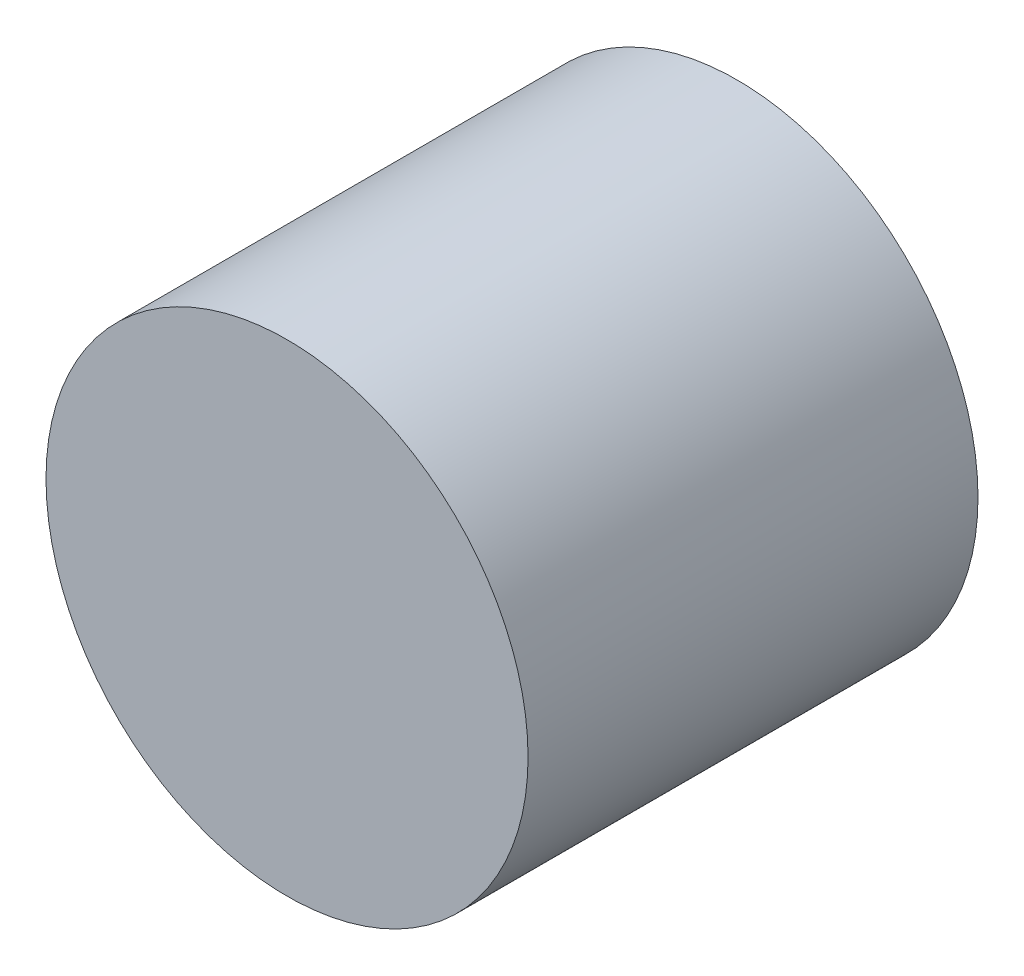
ISO-10303-21;
HEADER;
FILE_DESCRIPTION(('STEP AP214'),'2;1');
FILE_NAME('part.step','',(''),(''),'','','');
FILE_SCHEMA(('AUTOMOTIVE_DESIGN { 1 0 10303 214 1 1 1 1 }'));
ENDSEC;
DATA;
#1=APPLICATION_CONTEXT('core data for automotive mechanical design processes');
#2=APPLICATION_PROTOCOL_DEFINITION('international standard','automotive_design',2000,#1);
#3=PRODUCT_CONTEXT('',#1,'mechanical');
#4=PRODUCT('Part','Part','',(#3));
#5=PRODUCT_RELATED_PRODUCT_CATEGORY('part','',(#4));
#6=PRODUCT_DEFINITION_FORMATION('','',#4);
#7=PRODUCT_DEFINITION_CONTEXT('part definition',#1,'design');
#8=PRODUCT_DEFINITION('design','',#6,#7);
#9=PRODUCT_DEFINITION_SHAPE('','',#8);
#10=(LENGTH_UNIT() NAMED_UNIT(*) SI_UNIT(.MILLI.,.METRE.));
#11=(NAMED_UNIT(*) PLANE_ANGLE_UNIT() SI_UNIT($,.RADIAN.));
#12=(NAMED_UNIT(*) SI_UNIT($,.STERADIAN.) SOLID_ANGLE_UNIT());
#13=UNCERTAINTY_MEASURE_WITH_UNIT(LENGTH_MEASURE(1.E-05),#10,'distance_accuracy_value','');
#14=(GEOMETRIC_REPRESENTATION_CONTEXT(3) GLOBAL_UNCERTAINTY_ASSIGNED_CONTEXT((#13)) GLOBAL_UNIT_ASSIGNED_CONTEXT((#10,
#11,#12)) REPRESENTATION_CONTEXT('',''));
#15=CARTESIAN_POINT('',(0.,0.,0.));
#16=DIRECTION('',(0.,0.,1.));
#17=DIRECTION('',(1.,0.,0.));
#18=AXIS2_PLACEMENT_3D('',#15,#16,#17);
#19=CARTESIAN_POINT('',(1.49999954,0.,0.));
#20=DIRECTION('',(0.,0.,-1.));
#21=DIRECTION('',(-1.,0.,0.));
#22=AXIS2_PLACEMENT_3D('',#19,#20,#21);
#23=PLANE('',#22);
#24=CARTESIAN_POINT('',(0.,0.,0.));
#25=DIRECTION('',(0.,0.,-1.));
#26=DIRECTION('',(-1.,0.,0.));
#27=AXIS2_PLACEMENT_3D('',#24,#25,#26);
#28=CIRCLE('',#27,1.49999954);
#29=CARTESIAN_POINT('',(-1.49999954,0.,0.));
#30=VERTEX_POINT('',#29);
#31=EDGE_CURVE('E18',#30,#30,#28,.F.);
#32=ORIENTED_EDGE('',*,*,#31,.F.);
#33=EDGE_LOOP('',(#32));
#34=FACE_BOUND('',#33,.T.);
#35=ADVANCED_FACE('F15',(#34),#23,.T.);
#36=CARTESIAN_POINT('',(1.49999954,0.,2.79999948));
#37=DIRECTION('',(0.,0.,-1.));
#38=DIRECTION('',(-1.,0.,0.));
#39=AXIS2_PLACEMENT_3D('',#36,#37,#38);
#40=PLANE('',#39);
#41=CARTESIAN_POINT('',(0.,0.,2.79999948));
#42=DIRECTION('',(0.,0.,-1.));
#43=DIRECTION('',(-1.,0.,0.));
#44=AXIS2_PLACEMENT_3D('',#41,#42,#43);
#45=CIRCLE('',#44,1.49999954);
#46=CARTESIAN_POINT('',(-1.49999954,0.,2.79999948));
#47=VERTEX_POINT('',#46);
#48=EDGE_CURVE('E10',#47,#47,#45,.T.);
#49=ORIENTED_EDGE('',*,*,#48,.F.);
#50=EDGE_LOOP('',(#49));
#51=FACE_BOUND('',#50,.T.);
#52=ADVANCED_FACE('F30',(#51),#40,.F.);
#53=CARTESIAN_POINT('',(0.,0.,0.));
#54=DIRECTION('',(0.,0.,-1.));
#55=DIRECTION('',(-1.,0.,0.));
#56=AXIS2_PLACEMENT_3D('',#53,#54,#55);
#57=CYLINDRICAL_SURFACE('',#56,1.49999954);
#58=ORIENTED_EDGE('',*,*,#48,.T.);
#59=EDGE_LOOP('',(#58));
#60=FACE_BOUND('',#59,.T.);
#61=ORIENTED_EDGE('',*,*,#31,.T.);
#62=EDGE_LOOP('',(#61));
#63=FACE_BOUND('',#62,.T.);
#64=ADVANCED_FACE('F27',(#60,#63),#57,.T.);
#65=CLOSED_SHELL('',(#35,#52,#64));
#66=MANIFOLD_SOLID_BREP('B1',#65);
#67=ADVANCED_BREP_SHAPE_REPRESENTATION('',(#18,#66),#14);
#68=SHAPE_DEFINITION_REPRESENTATION(#9,#67);
ENDSEC;
END-ISO-10303-21;
